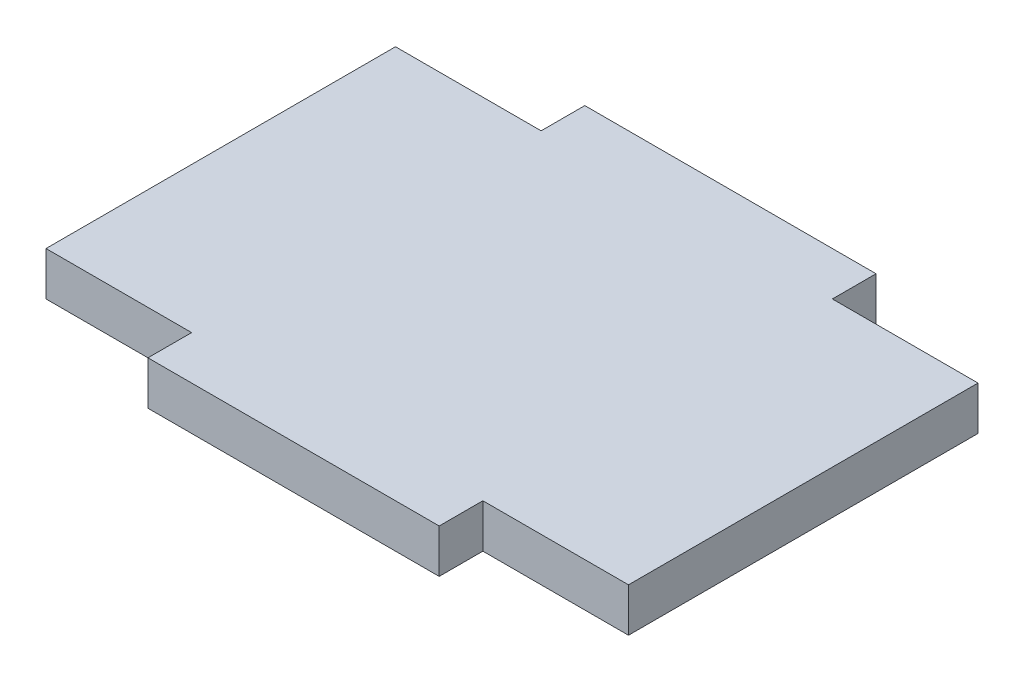
ISO-10303-21;
HEADER;
FILE_DESCRIPTION(('STEP AP214'),'2;1');
FILE_NAME('part.step','',(''),(''),'','','');
FILE_SCHEMA(('AUTOMOTIVE_DESIGN { 1 0 10303 214 1 1 1 1 }'));
ENDSEC;
DATA;
#1=APPLICATION_CONTEXT('core data for automotive mechanical design processes');
#2=APPLICATION_PROTOCOL_DEFINITION('international standard','automotive_design',2000,#1);
#3=PRODUCT_CONTEXT('',#1,'mechanical');
#4=PRODUCT('Part','Part','',(#3));
#5=PRODUCT_RELATED_PRODUCT_CATEGORY('part','',(#4));
#6=PRODUCT_DEFINITION_FORMATION('','',#4);
#7=PRODUCT_DEFINITION_CONTEXT('part definition',#1,'design');
#8=PRODUCT_DEFINITION('design','',#6,#7);
#9=PRODUCT_DEFINITION_SHAPE('','',#8);
#10=(LENGTH_UNIT() NAMED_UNIT(*) SI_UNIT(.MILLI.,.METRE.));
#11=(NAMED_UNIT(*) PLANE_ANGLE_UNIT() SI_UNIT($,.RADIAN.));
#12=(NAMED_UNIT(*) SI_UNIT($,.STERADIAN.) SOLID_ANGLE_UNIT());
#13=UNCERTAINTY_MEASURE_WITH_UNIT(LENGTH_MEASURE(1.E-05),#10,'distance_accuracy_value','');
#14=(GEOMETRIC_REPRESENTATION_CONTEXT(3) GLOBAL_UNCERTAINTY_ASSIGNED_CONTEXT((#13)) GLOBAL_UNIT_ASSIGNED_CONTEXT((#10,
#11,#12)) REPRESENTATION_CONTEXT('',''));
#15=CARTESIAN_POINT('',(0.,0.,0.));
#16=DIRECTION('',(0.,0.,1.));
#17=DIRECTION('',(1.,0.,0.));
#18=AXIS2_PLACEMENT_3D('',#15,#16,#17);
#19=CARTESIAN_POINT('',(-10.,3.,-12.));
#20=DIRECTION('',(1.,0.,0.));
#21=DIRECTION('',(0.,0.,-1.));
#22=AXIS2_PLACEMENT_3D('',#19,#20,#21);
#23=PLANE('',#22);
#24=DIRECTION('',(0.,0.,1.));
#25=VECTOR('',#24,1.);
#26=CARTESIAN_POINT('',(-10.,0.,-12.));
#27=LINE('',#26,#25);
#28=CARTESIAN_POINT('',(-10.,0.,-15.));
#29=VERTEX_POINT('',#28);
#30=CARTESIAN_POINT('',(-10.,0.,-12.));
#31=VERTEX_POINT('',#30);
#32=EDGE_CURVE('E164',#29,#31,#27,.T.);
#33=ORIENTED_EDGE('',*,*,#32,.T.);
#34=DIRECTION('',(0.,-1.,0.));
#35=VECTOR('',#34,1.);
#36=CARTESIAN_POINT('',(-10.,3.,-12.));
#37=LINE('',#36,#35);
#38=CARTESIAN_POINT('',(-10.,3.,-12.));
#39=VERTEX_POINT('',#38);
#40=EDGE_CURVE('E11',#39,#31,#37,.T.);
#41=ORIENTED_EDGE('',*,*,#40,.F.);
#42=DIRECTION('',(0.,0.,1.));
#43=VECTOR('',#42,1.);
#44=CARTESIAN_POINT('',(-10.,3.,-12.));
#45=LINE('',#44,#43);
#46=CARTESIAN_POINT('',(-10.,3.,-15.));
#47=VERTEX_POINT('',#46);
#48=EDGE_CURVE('E198',#47,#39,#45,.T.);
#49=ORIENTED_EDGE('',*,*,#48,.F.);
#50=DIRECTION('',(0.,-1.,0.));
#51=VECTOR('',#50,1.);
#52=CARTESIAN_POINT('',(-10.,3.,-15.));
#53=LINE('',#52,#51);
#54=EDGE_CURVE('E160',#47,#29,#53,.T.);
#55=ORIENTED_EDGE('',*,*,#54,.T.);
#56=EDGE_LOOP('',(#33,#41,#49,#55));
#57=FACE_BOUND('',#56,.T.);
#58=ADVANCED_FACE('F39',(#57),#23,.F.);
#59=CARTESIAN_POINT('',(-20.,3.,-12.));
#60=DIRECTION('',(0.,0.,1.));
#61=DIRECTION('',(1.,0.,0.));
#62=AXIS2_PLACEMENT_3D('',#59,#60,#61);
#63=PLANE('',#62);
#64=DIRECTION('',(-1.,0.,0.));
#65=VECTOR('',#64,1.);
#66=CARTESIAN_POINT('',(-20.,0.,-12.));
#67=LINE('',#66,#65);
#68=CARTESIAN_POINT('',(-20.,0.,-12.));
#69=VERTEX_POINT('',#68);
#70=EDGE_CURVE('E168',#31,#69,#67,.T.);
#71=ORIENTED_EDGE('',*,*,#70,.T.);
#72=DIRECTION('',(0.,-1.,0.));
#73=VECTOR('',#72,1.);
#74=CARTESIAN_POINT('',(-20.,3.,-12.));
#75=LINE('',#74,#73);
#76=CARTESIAN_POINT('',(-20.,3.,-12.));
#77=VERTEX_POINT('',#76);
#78=EDGE_CURVE('E48',#77,#69,#75,.T.);
#79=ORIENTED_EDGE('',*,*,#78,.F.);
#80=DIRECTION('',(-1.,0.,0.));
#81=VECTOR('',#80,1.);
#82=CARTESIAN_POINT('',(-20.,3.,-12.));
#83=LINE('',#82,#81);
#84=EDGE_CURVE('E111',#39,#77,#83,.T.);
#85=ORIENTED_EDGE('',*,*,#84,.F.);
#86=ORIENTED_EDGE('',*,*,#40,.T.);
#87=EDGE_LOOP('',(#71,#79,#85,#86));
#88=FACE_BOUND('',#87,.T.);
#89=ADVANCED_FACE('F292',(#88),#63,.F.);
#90=CARTESIAN_POINT('',(-20.,3.,12.));
#91=DIRECTION('',(1.,0.,0.));
#92=DIRECTION('',(0.,0.,-1.));
#93=AXIS2_PLACEMENT_3D('',#90,#91,#92);
#94=PLANE('',#93);
#95=DIRECTION('',(0.,0.,1.));
#96=VECTOR('',#95,1.);
#97=CARTESIAN_POINT('',(-20.,0.,12.));
#98=LINE('',#97,#96);
#99=CARTESIAN_POINT('',(-20.,0.,12.));
#100=VERTEX_POINT('',#99);
#101=EDGE_CURVE('E171',#69,#100,#98,.T.);
#102=ORIENTED_EDGE('',*,*,#101,.T.);
#103=DIRECTION('',(0.,-1.,0.));
#104=VECTOR('',#103,1.);
#105=CARTESIAN_POINT('',(-20.,3.,12.));
#106=LINE('',#105,#104);
#107=CARTESIAN_POINT('',(-20.,3.,12.));
#108=VERTEX_POINT('',#107);
#109=EDGE_CURVE('E225',#108,#100,#106,.T.);
#110=ORIENTED_EDGE('',*,*,#109,.F.);
#111=DIRECTION('',(0.,0.,1.));
#112=VECTOR('',#111,1.);
#113=CARTESIAN_POINT('',(-20.,3.,12.));
#114=LINE('',#113,#112);
#115=EDGE_CURVE('E235',#77,#108,#114,.T.);
#116=ORIENTED_EDGE('',*,*,#115,.F.);
#117=ORIENTED_EDGE('',*,*,#78,.T.);
#118=EDGE_LOOP('',(#102,#110,#116,#117));
#119=FACE_BOUND('',#118,.T.);
#120=ADVANCED_FACE('F233',(#119),#94,.F.);
#121=CARTESIAN_POINT('',(-10.,3.,12.));
#122=DIRECTION('',(0.,0.,-1.));
#123=DIRECTION('',(-1.,0.,0.));
#124=AXIS2_PLACEMENT_3D('',#121,#122,#123);
#125=PLANE('',#124);
#126=DIRECTION('',(1.,0.,0.));
#127=VECTOR('',#126,1.);
#128=CARTESIAN_POINT('',(-10.,0.,12.));
#129=LINE('',#128,#127);
#130=CARTESIAN_POINT('',(-10.,0.,12.));
#131=VERTEX_POINT('',#130);
#132=EDGE_CURVE('E174',#100,#131,#129,.T.);
#133=ORIENTED_EDGE('',*,*,#132,.T.);
#134=DIRECTION('',(0.,-1.,0.));
#135=VECTOR('',#134,1.);
#136=CARTESIAN_POINT('',(-10.,3.,12.));
#137=LINE('',#136,#135);
#138=CARTESIAN_POINT('',(-10.,3.,12.));
#139=VERTEX_POINT('',#138);
#140=EDGE_CURVE('E221',#139,#131,#137,.T.);
#141=ORIENTED_EDGE('',*,*,#140,.F.);
#142=DIRECTION('',(1.,0.,0.));
#143=VECTOR('',#142,1.);
#144=CARTESIAN_POINT('',(-10.,3.,12.));
#145=LINE('',#144,#143);
#146=EDGE_CURVE('E254',#108,#139,#145,.T.);
#147=ORIENTED_EDGE('',*,*,#146,.F.);
#148=ORIENTED_EDGE('',*,*,#109,.T.);
#149=EDGE_LOOP('',(#133,#141,#147,#148));
#150=FACE_BOUND('',#149,.T.);
#151=ADVANCED_FACE('F244',(#150),#125,.F.);
#152=CARTESIAN_POINT('',(-10.,3.,15.));
#153=DIRECTION('',(1.,0.,0.));
#154=DIRECTION('',(0.,0.,-1.));
#155=AXIS2_PLACEMENT_3D('',#152,#153,#154);
#156=PLANE('',#155);
#157=DIRECTION('',(0.,0.,1.));
#158=VECTOR('',#157,1.);
#159=CARTESIAN_POINT('',(-10.,0.,15.));
#160=LINE('',#159,#158);
#161=CARTESIAN_POINT('',(-10.,0.,15.));
#162=VERTEX_POINT('',#161);
#163=EDGE_CURVE('E177',#131,#162,#160,.T.);
#164=ORIENTED_EDGE('',*,*,#163,.T.);
#165=DIRECTION('',(0.,-1.,0.));
#166=VECTOR('',#165,1.);
#167=CARTESIAN_POINT('',(-10.,3.,15.));
#168=LINE('',#167,#166);
#169=CARTESIAN_POINT('',(-10.,3.,15.));
#170=VERTEX_POINT('',#169);
#171=EDGE_CURVE('E217',#170,#162,#168,.T.);
#172=ORIENTED_EDGE('',*,*,#171,.F.);
#173=DIRECTION('',(0.,0.,1.));
#174=VECTOR('',#173,1.);
#175=CARTESIAN_POINT('',(-10.,3.,15.));
#176=LINE('',#175,#174);
#177=EDGE_CURVE('E250',#139,#170,#176,.T.);
#178=ORIENTED_EDGE('',*,*,#177,.F.);
#179=ORIENTED_EDGE('',*,*,#140,.T.);
#180=EDGE_LOOP('',(#164,#172,#178,#179));
#181=FACE_BOUND('',#180,.T.);
#182=ADVANCED_FACE('F248',(#181),#156,.F.);
#183=CARTESIAN_POINT('',(10.,3.,15.));
#184=DIRECTION('',(0.,0.,-1.));
#185=DIRECTION('',(-1.,0.,0.));
#186=AXIS2_PLACEMENT_3D('',#183,#184,#185);
#187=PLANE('',#186);
#188=DIRECTION('',(1.,0.,0.));
#189=VECTOR('',#188,1.);
#190=CARTESIAN_POINT('',(10.,0.,15.));
#191=LINE('',#190,#189);
#192=CARTESIAN_POINT('',(10.,0.,15.));
#193=VERTEX_POINT('',#192);
#194=EDGE_CURVE('E180',#162,#193,#191,.T.);
#195=ORIENTED_EDGE('',*,*,#194,.T.);
#196=DIRECTION('',(0.,-1.,0.));
#197=VECTOR('',#196,1.);
#198=CARTESIAN_POINT('',(10.,3.,15.));
#199=LINE('',#198,#197);
#200=CARTESIAN_POINT('',(10.,3.,15.));
#201=VERTEX_POINT('',#200);
#202=EDGE_CURVE('E213',#201,#193,#199,.T.);
#203=ORIENTED_EDGE('',*,*,#202,.F.);
#204=DIRECTION('',(1.,0.,0.));
#205=VECTOR('',#204,1.);
#206=CARTESIAN_POINT('',(10.,3.,15.));
#207=LINE('',#206,#205);
#208=EDGE_CURVE('E253',#170,#201,#207,.T.);
#209=ORIENTED_EDGE('',*,*,#208,.F.);
#210=ORIENTED_EDGE('',*,*,#171,.T.);
#211=EDGE_LOOP('',(#195,#203,#209,#210));
#212=FACE_BOUND('',#211,.T.);
#213=ADVANCED_FACE('F305',(#212),#187,.F.);
#214=CARTESIAN_POINT('',(10.,3.,12.));
#215=DIRECTION('',(-1.,0.,0.));
#216=DIRECTION('',(0.,0.,1.));
#217=AXIS2_PLACEMENT_3D('',#214,#215,#216);
#218=PLANE('',#217);
#219=DIRECTION('',(0.,0.,-1.));
#220=VECTOR('',#219,1.);
#221=CARTESIAN_POINT('',(10.,0.,12.));
#222=LINE('',#221,#220);
#223=CARTESIAN_POINT('',(10.,0.,12.));
#224=VERTEX_POINT('',#223);
#225=EDGE_CURVE('E183',#193,#224,#222,.T.);
#226=ORIENTED_EDGE('',*,*,#225,.T.);
#227=DIRECTION('',(0.,-1.,0.));
#228=VECTOR('',#227,1.);
#229=CARTESIAN_POINT('',(10.,3.,12.));
#230=LINE('',#229,#228);
#231=CARTESIAN_POINT('',(10.,3.,12.));
#232=VERTEX_POINT('',#231);
#233=EDGE_CURVE('E209',#232,#224,#230,.T.);
#234=ORIENTED_EDGE('',*,*,#233,.F.);
#235=DIRECTION('',(0.,0.,-1.));
#236=VECTOR('',#235,1.);
#237=CARTESIAN_POINT('',(10.,3.,12.));
#238=LINE('',#237,#236);
#239=EDGE_CURVE('E258',#201,#232,#238,.T.);
#240=ORIENTED_EDGE('',*,*,#239,.F.);
#241=ORIENTED_EDGE('',*,*,#202,.T.);
#242=EDGE_LOOP('',(#226,#234,#240,#241));
#243=FACE_BOUND('',#242,.T.);
#244=ADVANCED_FACE('F308',(#243),#218,.F.);
#245=CARTESIAN_POINT('',(20.,3.,12.));
#246=DIRECTION('',(0.,0.,-1.));
#247=DIRECTION('',(-1.,0.,0.));
#248=AXIS2_PLACEMENT_3D('',#245,#246,#247);
#249=PLANE('',#248);
#250=DIRECTION('',(1.,0.,0.));
#251=VECTOR('',#250,1.);
#252=CARTESIAN_POINT('',(20.,0.,12.));
#253=LINE('',#252,#251);
#254=CARTESIAN_POINT('',(20.,0.,12.));
#255=VERTEX_POINT('',#254);
#256=EDGE_CURVE('E186',#224,#255,#253,.T.);
#257=ORIENTED_EDGE('',*,*,#256,.T.);
#258=DIRECTION('',(0.,-1.,0.));
#259=VECTOR('',#258,1.);
#260=CARTESIAN_POINT('',(20.,3.,12.));
#261=LINE('',#260,#259);
#262=CARTESIAN_POINT('',(20.,3.,12.));
#263=VERTEX_POINT('',#262);
#264=EDGE_CURVE('E205',#263,#255,#261,.T.);
#265=ORIENTED_EDGE('',*,*,#264,.F.);
#266=DIRECTION('',(1.,0.,0.));
#267=VECTOR('',#266,1.);
#268=CARTESIAN_POINT('',(20.,3.,12.));
#269=LINE('',#268,#267);
#270=EDGE_CURVE('E265',#232,#263,#269,.T.);
#271=ORIENTED_EDGE('',*,*,#270,.F.);
#272=ORIENTED_EDGE('',*,*,#233,.T.);
#273=EDGE_LOOP('',(#257,#265,#271,#272));
#274=FACE_BOUND('',#273,.T.);
#275=ADVANCED_FACE('F273',(#274),#249,.F.);
#276=CARTESIAN_POINT('',(20.,3.,-12.));
#277=DIRECTION('',(-1.,0.,0.));
#278=DIRECTION('',(0.,0.,1.));
#279=AXIS2_PLACEMENT_3D('',#276,#277,#278);
#280=PLANE('',#279);
#281=DIRECTION('',(0.,0.,-1.));
#282=VECTOR('',#281,1.);
#283=CARTESIAN_POINT('',(20.,0.,-12.));
#284=LINE('',#283,#282);
#285=CARTESIAN_POINT('',(20.,0.,-12.));
#286=VERTEX_POINT('',#285);
#287=EDGE_CURVE('E189',#255,#286,#284,.T.);
#288=ORIENTED_EDGE('',*,*,#287,.T.);
#289=DIRECTION('',(0.,-1.,0.));
#290=VECTOR('',#289,1.);
#291=CARTESIAN_POINT('',(20.,3.,-12.));
#292=LINE('',#291,#290);
#293=CARTESIAN_POINT('',(20.,3.,-12.));
#294=VERTEX_POINT('',#293);
#295=EDGE_CURVE('E153',#294,#286,#292,.T.);
#296=ORIENTED_EDGE('',*,*,#295,.F.);
#297=DIRECTION('',(0.,0.,-1.));
#298=VECTOR('',#297,1.);
#299=CARTESIAN_POINT('',(20.,3.,-12.));
#300=LINE('',#299,#298);
#301=EDGE_CURVE('E142',#263,#294,#300,.T.);
#302=ORIENTED_EDGE('',*,*,#301,.F.);
#303=ORIENTED_EDGE('',*,*,#264,.T.);
#304=EDGE_LOOP('',(#288,#296,#302,#303));
#305=FACE_BOUND('',#304,.T.);
#306=ADVANCED_FACE('F277',(#305),#280,.F.);
#307=CARTESIAN_POINT('',(10.,3.,-12.));
#308=DIRECTION('',(0.,0.,1.));
#309=DIRECTION('',(1.,0.,0.));
#310=AXIS2_PLACEMENT_3D('',#307,#308,#309);
#311=PLANE('',#310);
#312=DIRECTION('',(-1.,0.,0.));
#313=VECTOR('',#312,1.);
#314=CARTESIAN_POINT('',(10.,0.,-12.));
#315=LINE('',#314,#313);
#316=CARTESIAN_POINT('',(10.,0.,-12.));
#317=VERTEX_POINT('',#316);
#318=EDGE_CURVE('E151',#286,#317,#315,.T.);
#319=ORIENTED_EDGE('',*,*,#318,.T.);
#320=DIRECTION('',(0.,-1.,0.));
#321=VECTOR('',#320,1.);
#322=CARTESIAN_POINT('',(10.,3.,-12.));
#323=LINE('',#322,#321);
#324=CARTESIAN_POINT('',(10.,3.,-12.));
#325=VERTEX_POINT('',#324);
#326=EDGE_CURVE('E148',#325,#317,#323,.T.);
#327=ORIENTED_EDGE('',*,*,#326,.F.);
#328=DIRECTION('',(-1.,0.,0.));
#329=VECTOR('',#328,1.);
#330=CARTESIAN_POINT('',(10.,3.,-12.));
#331=LINE('',#330,#329);
#332=EDGE_CURVE('E136',#294,#325,#331,.T.);
#333=ORIENTED_EDGE('',*,*,#332,.F.);
#334=ORIENTED_EDGE('',*,*,#295,.T.);
#335=EDGE_LOOP('',(#319,#327,#333,#334));
#336=FACE_BOUND('',#335,.T.);
#337=ADVANCED_FACE('F149',(#336),#311,.F.);
#338=CARTESIAN_POINT('',(10.,3.,-15.));
#339=DIRECTION('',(-1.,0.,0.));
#340=DIRECTION('',(0.,0.,1.));
#341=AXIS2_PLACEMENT_3D('',#338,#339,#340);
#342=PLANE('',#341);
#343=DIRECTION('',(0.,0.,-1.));
#344=VECTOR('',#343,1.);
#345=CARTESIAN_POINT('',(10.,0.,-15.));
#346=LINE('',#345,#344);
#347=CARTESIAN_POINT('',(10.,0.,-15.));
#348=VERTEX_POINT('',#347);
#349=EDGE_CURVE('E97',#317,#348,#346,.T.);
#350=ORIENTED_EDGE('',*,*,#349,.T.);
#351=DIRECTION('',(0.,-1.,0.));
#352=VECTOR('',#351,1.);
#353=CARTESIAN_POINT('',(10.,3.,-15.));
#354=LINE('',#353,#352);
#355=CARTESIAN_POINT('',(10.,3.,-15.));
#356=VERTEX_POINT('',#355);
#357=EDGE_CURVE('E154',#356,#348,#354,.T.);
#358=ORIENTED_EDGE('',*,*,#357,.F.);
#359=DIRECTION('',(0.,0.,-1.));
#360=VECTOR('',#359,1.);
#361=CARTESIAN_POINT('',(10.,3.,-15.));
#362=LINE('',#361,#360);
#363=EDGE_CURVE('E140',#325,#356,#362,.T.);
#364=ORIENTED_EDGE('',*,*,#363,.F.);
#365=ORIENTED_EDGE('',*,*,#326,.T.);
#366=EDGE_LOOP('',(#350,#358,#364,#365));
#367=FACE_BOUND('',#366,.T.);
#368=ADVANCED_FACE('F156',(#367),#342,.F.);
#369=CARTESIAN_POINT('',(-10.,3.,-15.));
#370=DIRECTION('',(0.,0.,1.));
#371=DIRECTION('',(1.,0.,0.));
#372=AXIS2_PLACEMENT_3D('',#369,#370,#371);
#373=PLANE('',#372);
#374=DIRECTION('',(-1.,0.,0.));
#375=VECTOR('',#374,1.);
#376=CARTESIAN_POINT('',(-10.,0.,-15.));
#377=LINE('',#376,#375);
#378=EDGE_CURVE('E103',#348,#29,#377,.T.);
#379=ORIENTED_EDGE('',*,*,#378,.T.);
#380=ORIENTED_EDGE('',*,*,#54,.F.);
#381=DIRECTION('',(-1.,0.,0.));
#382=VECTOR('',#381,1.);
#383=CARTESIAN_POINT('',(-10.,3.,-15.));
#384=LINE('',#383,#382);
#385=EDGE_CURVE('E56',#356,#47,#384,.T.);
#386=ORIENTED_EDGE('',*,*,#385,.F.);
#387=ORIENTED_EDGE('',*,*,#357,.T.);
#388=EDGE_LOOP('',(#379,#380,#386,#387));
#389=FACE_BOUND('',#388,.T.);
#390=ADVANCED_FACE('F281',(#389),#373,.F.);
#391=CARTESIAN_POINT('',(0.,3.,0.));
#392=DIRECTION('',(0.,-1.,0.));
#393=DIRECTION('',(0.,0.,-1.));
#394=AXIS2_PLACEMENT_3D('',#391,#392,#393);
#395=PLANE('',#394);
#396=ORIENTED_EDGE('',*,*,#48,.T.);
#397=ORIENTED_EDGE('',*,*,#84,.T.);
#398=ORIENTED_EDGE('',*,*,#115,.T.);
#399=ORIENTED_EDGE('',*,*,#146,.T.);
#400=ORIENTED_EDGE('',*,*,#177,.T.);
#401=ORIENTED_EDGE('',*,*,#208,.T.);
#402=ORIENTED_EDGE('',*,*,#239,.T.);
#403=ORIENTED_EDGE('',*,*,#270,.T.);
#404=ORIENTED_EDGE('',*,*,#301,.T.);
#405=ORIENTED_EDGE('',*,*,#332,.T.);
#406=ORIENTED_EDGE('',*,*,#363,.T.);
#407=ORIENTED_EDGE('',*,*,#385,.T.);
#408=EDGE_LOOP('',(#396,#397,#398,#399,#400,#401,#402,#403,#404,#405,#406,#407));
#409=FACE_BOUND('',#408,.T.);
#410=ADVANCED_FACE('F138',(#409),#395,.F.);
#411=CARTESIAN_POINT('',(0.,0.,0.));
#412=DIRECTION('',(0.,-1.,0.));
#413=DIRECTION('',(0.,0.,-1.));
#414=AXIS2_PLACEMENT_3D('',#411,#412,#413);
#415=PLANE('',#414);
#416=ORIENTED_EDGE('',*,*,#32,.F.);
#417=ORIENTED_EDGE('',*,*,#378,.F.);
#418=ORIENTED_EDGE('',*,*,#349,.F.);
#419=ORIENTED_EDGE('',*,*,#318,.F.);
#420=ORIENTED_EDGE('',*,*,#287,.F.);
#421=ORIENTED_EDGE('',*,*,#256,.F.);
#422=ORIENTED_EDGE('',*,*,#225,.F.);
#423=ORIENTED_EDGE('',*,*,#194,.F.);
#424=ORIENTED_EDGE('',*,*,#163,.F.);
#425=ORIENTED_EDGE('',*,*,#132,.F.);
#426=ORIENTED_EDGE('',*,*,#101,.F.);
#427=ORIENTED_EDGE('',*,*,#70,.F.);
#428=EDGE_LOOP('',(#416,#417,#418,#419,#420,#421,#422,#423,#424,#425,#426,#427));
#429=FACE_BOUND('',#428,.T.);
#430=ADVANCED_FACE('F239',(#429),#415,.T.);
#431=CLOSED_SHELL('',(#58,#89,#120,#151,#182,#213,#244,#275,#306,#337,#368,#390,#410,#430));
#432=MANIFOLD_SOLID_BREP('B2',#431);
#433=ADVANCED_BREP_SHAPE_REPRESENTATION('',(#18,#432),#14);
#434=SHAPE_DEFINITION_REPRESENTATION(#9,#433);
ENDSEC;
END-ISO-10303-21;
